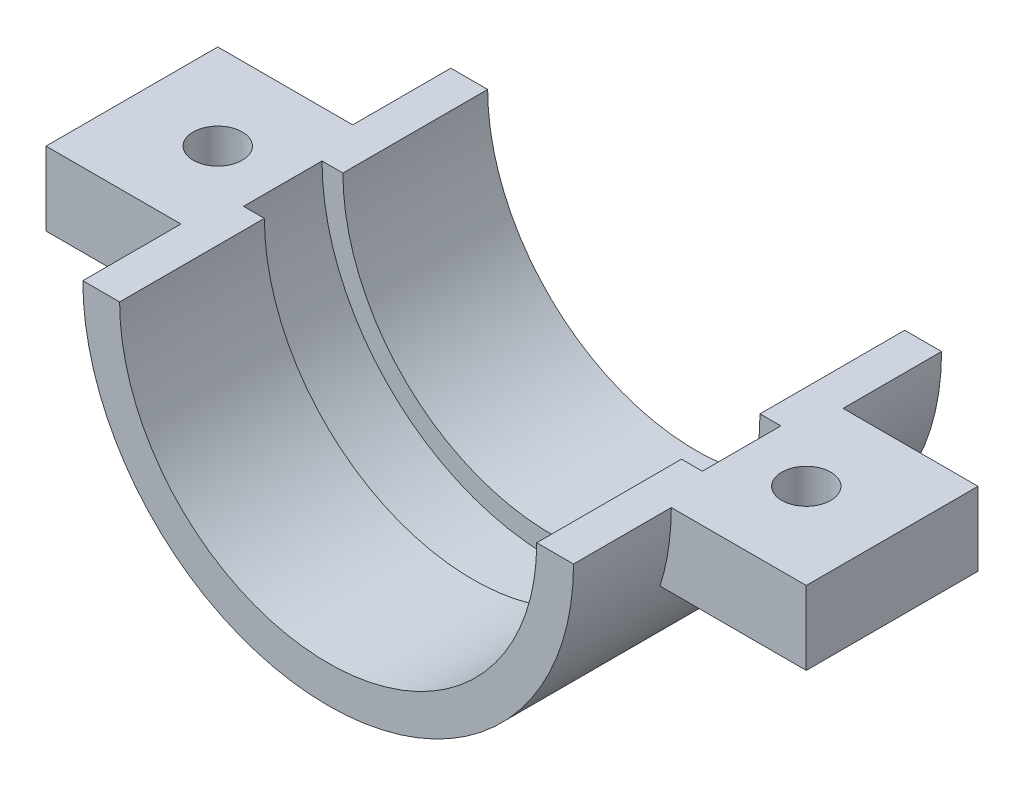
ISO-10303-21;
HEADER;
FILE_DESCRIPTION(('STEP AP214'),'2;1');
FILE_NAME('part.step','',(''),(''),'','','');
FILE_SCHEMA(('AUTOMOTIVE_DESIGN { 1 0 10303 214 1 1 1 1 }'));
ENDSEC;
DATA;
#1=APPLICATION_CONTEXT('core data for automotive mechanical design processes');
#2=APPLICATION_PROTOCOL_DEFINITION('international standard','automotive_design',2000,#1);
#3=PRODUCT_CONTEXT('',#1,'mechanical');
#4=PRODUCT('Part','Part','',(#3));
#5=PRODUCT_RELATED_PRODUCT_CATEGORY('part','',(#4));
#6=PRODUCT_DEFINITION_FORMATION('','',#4);
#7=PRODUCT_DEFINITION_CONTEXT('part definition',#1,'design');
#8=PRODUCT_DEFINITION('design','',#6,#7);
#9=PRODUCT_DEFINITION_SHAPE('','',#8);
#10=(LENGTH_UNIT() NAMED_UNIT(*) SI_UNIT(.MILLI.,.METRE.));
#11=(NAMED_UNIT(*) PLANE_ANGLE_UNIT() SI_UNIT($,.RADIAN.));
#12=(NAMED_UNIT(*) SI_UNIT($,.STERADIAN.) SOLID_ANGLE_UNIT());
#13=UNCERTAINTY_MEASURE_WITH_UNIT(LENGTH_MEASURE(1.E-05),#10,'distance_accuracy_value','');
#14=(GEOMETRIC_REPRESENTATION_CONTEXT(3) GLOBAL_UNCERTAINTY_ASSIGNED_CONTEXT((#13)) GLOBAL_UNIT_ASSIGNED_CONTEXT((#10,
#11,#12)) REPRESENTATION_CONTEXT('',''));
#15=CARTESIAN_POINT('',(0.,0.,0.));
#16=DIRECTION('',(0.,0.,1.));
#17=DIRECTION('',(1.,0.,0.));
#18=AXIS2_PLACEMENT_3D('',#15,#16,#17);
#19=CARTESIAN_POINT('',(0.,0.,15.));
#20=DIRECTION('',(0.,0.,-1.));
#21=DIRECTION('',(-1.,0.,0.));
#22=AXIS2_PLACEMENT_3D('',#19,#20,#21);
#23=CYLINDRICAL_SURFACE('',#22,8.5);
#24=CARTESIAN_POINT('',(0.,0.,9.1));
#25=DIRECTION('',(0.,0.,1.));
#26=DIRECTION('',(-1.,0.,0.));
#27=AXIS2_PLACEMENT_3D('',#24,#25,#26);
#28=CIRCLE('',#27,8.5);
#29=CARTESIAN_POINT('',(-8.5,0.,9.1));
#30=VERTEX_POINT('',#29);
#31=CARTESIAN_POINT('',(8.5,0.,9.1));
#32=VERTEX_POINT('',#31);
#33=EDGE_CURVE('E148',#30,#32,#28,.T.);
#34=ORIENTED_EDGE('',*,*,#33,.F.);
#35=DIRECTION('',(0.,0.,-1.));
#36=VECTOR('',#35,1.);
#37=CARTESIAN_POINT('',(-8.5,0.,15.));
#38=LINE('',#37,#36);
#39=CARTESIAN_POINT('',(-8.5,0.,15.));
#40=VERTEX_POINT('',#39);
#41=EDGE_CURVE('E188',#40,#30,#38,.T.);
#42=ORIENTED_EDGE('',*,*,#41,.F.);
#43=CARTESIAN_POINT('',(0.,0.,15.));
#44=DIRECTION('',(0.,0.,-1.));
#45=DIRECTION('',(1.,0.,0.));
#46=AXIS2_PLACEMENT_3D('',#43,#44,#45);
#47=CIRCLE('',#46,8.5);
#48=CARTESIAN_POINT('',(8.5,0.,15.));
#49=VERTEX_POINT('',#48);
#50=EDGE_CURVE('E172',#49,#40,#47,.T.);
#51=ORIENTED_EDGE('',*,*,#50,.F.);
#52=DIRECTION('',(0.,0.,-1.));
#53=VECTOR('',#52,1.);
#54=CARTESIAN_POINT('',(8.5,0.,15.));
#55=LINE('',#54,#53);
#56=EDGE_CURVE('E165',#49,#32,#55,.T.);
#57=ORIENTED_EDGE('',*,*,#56,.T.);
#58=EDGE_LOOP('',(#34,#42,#51,#57));
#59=FACE_BOUND('',#58,.T.);
#60=ADVANCED_FACE('F34',(#59),#23,.F.);
#61=CARTESIAN_POINT('',(-10.,0.,15.));
#62=DIRECTION('',(0.,-1.,0.));
#63=DIRECTION('',(0.,0.,-1.));
#64=AXIS2_PLACEMENT_3D('',#61,#62,#63);
#65=PLANE('',#64);
#66=CARTESIAN_POINT('',(-12.,0.,7.5));
#67=DIRECTION('',(0.,1.,0.));
#68=DIRECTION('',(0.,0.,1.));
#69=AXIS2_PLACEMENT_3D('',#66,#67,#68);
#70=CIRCLE('',#69,1.);
#71=CARTESIAN_POINT('',(-12.,0.,8.5));
#72=VERTEX_POINT('',#71);
#73=EDGE_CURVE('E301',#72,#72,#70,.T.);
#74=ORIENTED_EDGE('',*,*,#73,.F.);
#75=EDGE_LOOP('',(#74));
#76=FACE_BOUND('',#75,.T.);
#77=DIRECTION('',(1.,0.,0.));
#78=VECTOR('',#77,1.);
#79=CARTESIAN_POINT('',(-8.5,0.,9.1));
#80=LINE('',#79,#78);
#81=CARTESIAN_POINT('',(-9.35,0.,9.1));
#82=VERTEX_POINT('',#81);
#83=EDGE_CURVE('E155',#82,#30,#80,.T.);
#84=ORIENTED_EDGE('',*,*,#83,.F.);
#85=DIRECTION('',(0.,0.,-1.));
#86=VECTOR('',#85,1.);
#87=CARTESIAN_POINT('',(-9.35,0.,9.1));
#88=LINE('',#87,#86);
#89=CARTESIAN_POINT('',(-9.35,0.,5.9));
#90=VERTEX_POINT('',#89);
#91=EDGE_CURVE('E267',#82,#90,#88,.T.);
#92=ORIENTED_EDGE('',*,*,#91,.T.);
#93=DIRECTION('',(1.,0.,0.));
#94=VECTOR('',#93,1.);
#95=CARTESIAN_POINT('',(-8.5,0.,5.9));
#96=LINE('',#95,#94);
#97=CARTESIAN_POINT('',(-8.5,0.,5.9));
#98=VERTEX_POINT('',#97);
#99=EDGE_CURVE('E160',#90,#98,#96,.T.);
#100=ORIENTED_EDGE('',*,*,#99,.T.);
#101=CARTESIAN_POINT('',(-8.5,0.,0.));
#102=VERTEX_POINT('',#101);
#103=EDGE_CURVE('E187',#98,#102,#38,.T.);
#104=ORIENTED_EDGE('',*,*,#103,.T.);
#105=DIRECTION('',(-1.,0.,0.));
#106=VECTOR('',#105,1.);
#107=CARTESIAN_POINT('',(-10.,0.,0.));
#108=LINE('',#107,#106);
#109=CARTESIAN_POINT('',(-10.,0.,0.));
#110=VERTEX_POINT('',#109);
#111=EDGE_CURVE('E242',#102,#110,#108,.T.);
#112=ORIENTED_EDGE('',*,*,#111,.T.);
#113=DIRECTION('',(0.,0.,-1.));
#114=VECTOR('',#113,1.);
#115=CARTESIAN_POINT('',(-10.,0.,15.));
#116=LINE('',#115,#114);
#117=CARTESIAN_POINT('',(-10.,0.,4.00000000000003));
#118=VERTEX_POINT('',#117);
#119=EDGE_CURVE('E184',#118,#110,#116,.T.);
#120=ORIENTED_EDGE('',*,*,#119,.F.);
#121=DIRECTION('',(-1.,0.,0.));
#122=VECTOR('',#121,1.);
#123=CARTESIAN_POINT('',(-8.4999999999999,0.,4.00000000000005));
#124=LINE('',#123,#122);
#125=CARTESIAN_POINT('',(-15.4999999999999,0.,3.99999999999995));
#126=VERTEX_POINT('',#125);
#127=EDGE_CURVE('E224',#118,#126,#124,.T.);
#128=ORIENTED_EDGE('',*,*,#127,.T.);
#129=DIRECTION('',(0.,0.,1.));
#130=VECTOR('',#129,1.);
#131=CARTESIAN_POINT('',(-15.4999999999999,0.,3.99999999999995));
#132=LINE('',#131,#130);
#133=CARTESIAN_POINT('',(-15.5,0.,11.));
#134=VERTEX_POINT('',#133);
#135=EDGE_CURVE('E226',#126,#134,#132,.T.);
#136=ORIENTED_EDGE('',*,*,#135,.T.);
#137=DIRECTION('',(1.,0.,0.));
#138=VECTOR('',#137,1.);
#139=CARTESIAN_POINT('',(-15.5,0.,11.));
#140=LINE('',#139,#138);
#141=CARTESIAN_POINT('',(-10.,0.,11.0000000000001));
#142=VERTEX_POINT('',#141);
#143=EDGE_CURVE('E230',#134,#142,#140,.T.);
#144=ORIENTED_EDGE('',*,*,#143,.T.);
#145=CARTESIAN_POINT('',(-10.,0.,15.));
#146=VERTEX_POINT('',#145);
#147=EDGE_CURVE('E185',#146,#142,#116,.T.);
#148=ORIENTED_EDGE('',*,*,#147,.F.);
#149=DIRECTION('',(-1.,0.,0.));
#150=VECTOR('',#149,1.);
#151=CARTESIAN_POINT('',(-10.,0.,15.));
#152=LINE('',#151,#150);
#153=EDGE_CURVE('E235',#40,#146,#152,.T.);
#154=ORIENTED_EDGE('',*,*,#153,.F.);
#155=ORIENTED_EDGE('',*,*,#41,.T.);
#156=EDGE_LOOP('',(#84,#92,#100,#104,#112,#120,#128,#136,#144,#148,#154,#155));
#157=FACE_BOUND('',#156,.T.);
#158=ADVANCED_FACE('F313',(#76,#157),#65,.F.);
#159=CARTESIAN_POINT('',(8.5,0.,15.));
#160=DIRECTION('',(0.,-1.,0.));
#161=DIRECTION('',(0.,0.,-1.));
#162=AXIS2_PLACEMENT_3D('',#159,#160,#161);
#163=PLANE('',#162);
#164=CARTESIAN_POINT('',(12.,0.,7.51485119607753));
#165=DIRECTION('',(0.,1.,0.));
#166=DIRECTION('',(0.,0.,1.));
#167=AXIS2_PLACEMENT_3D('',#164,#165,#166);
#168=CIRCLE('',#167,1.);
#169=CARTESIAN_POINT('',(12.,0.,8.51485119607753));
#170=VERTEX_POINT('',#169);
#171=EDGE_CURVE('E270',#170,#170,#168,.T.);
#172=ORIENTED_EDGE('',*,*,#171,.F.);
#173=EDGE_LOOP('',(#172));
#174=FACE_BOUND('',#173,.T.);
#175=DIRECTION('',(1.,0.,0.));
#176=VECTOR('',#175,1.);
#177=CARTESIAN_POINT('',(9.35,0.,9.1));
#178=LINE('',#177,#176);
#179=CARTESIAN_POINT('',(9.35,0.,9.1));
#180=VERTEX_POINT('',#179);
#181=EDGE_CURVE('E152',#32,#180,#178,.T.);
#182=ORIENTED_EDGE('',*,*,#181,.F.);
#183=ORIENTED_EDGE('',*,*,#56,.F.);
#184=DIRECTION('',(-1.,0.,0.));
#185=VECTOR('',#184,1.);
#186=CARTESIAN_POINT('',(8.5,0.,15.));
#187=LINE('',#186,#185);
#188=CARTESIAN_POINT('',(10.,0.,15.));
#189=VERTEX_POINT('',#188);
#190=EDGE_CURVE('E178',#189,#49,#187,.T.);
#191=ORIENTED_EDGE('',*,*,#190,.F.);
#192=DIRECTION('',(0.,0.,-1.));
#193=VECTOR('',#192,1.);
#194=CARTESIAN_POINT('',(10.,0.,15.));
#195=LINE('',#194,#193);
#196=CARTESIAN_POINT('',(10.,0.,11.0148511960775));
#197=VERTEX_POINT('',#196);
#198=EDGE_CURVE('E176',#189,#197,#195,.T.);
#199=ORIENTED_EDGE('',*,*,#198,.T.);
#200=DIRECTION('',(1.,0.,0.));
#201=VECTOR('',#200,1.);
#202=CARTESIAN_POINT('',(15.5,0.,11.0148511960775));
#203=LINE('',#202,#201);
#204=CARTESIAN_POINT('',(15.5,0.,11.0148511960775));
#205=VERTEX_POINT('',#204);
#206=EDGE_CURVE('E275',#197,#205,#203,.T.);
#207=ORIENTED_EDGE('',*,*,#206,.T.);
#208=DIRECTION('',(0.,0.,-1.));
#209=VECTOR('',#208,1.);
#210=CARTESIAN_POINT('',(15.5,0.,4.01485119607753));
#211=LINE('',#210,#209);
#212=CARTESIAN_POINT('',(15.5,0.,4.01485119607753));
#213=VERTEX_POINT('',#212);
#214=EDGE_CURVE('E288',#205,#213,#211,.T.);
#215=ORIENTED_EDGE('',*,*,#214,.T.);
#216=DIRECTION('',(-1.,0.,0.));
#217=VECTOR('',#216,1.);
#218=CARTESIAN_POINT('',(8.5,0.,4.01485119607753));
#219=LINE('',#218,#217);
#220=CARTESIAN_POINT('',(10.,0.,4.01485119607753));
#221=VERTEX_POINT('',#220);
#222=EDGE_CURVE('E57',#213,#221,#219,.T.);
#223=ORIENTED_EDGE('',*,*,#222,.T.);
#224=CARTESIAN_POINT('',(10.,0.,0.));
#225=VERTEX_POINT('',#224);
#226=EDGE_CURVE('E173',#221,#225,#195,.T.);
#227=ORIENTED_EDGE('',*,*,#226,.T.);
#228=DIRECTION('',(-1.,0.,0.));
#229=VECTOR('',#228,1.);
#230=CARTESIAN_POINT('',(8.5,0.,0.));
#231=LINE('',#230,#229);
#232=CARTESIAN_POINT('',(8.5,0.,0.));
#233=VERTEX_POINT('',#232);
#234=EDGE_CURVE('E180',#225,#233,#231,.T.);
#235=ORIENTED_EDGE('',*,*,#234,.T.);
#236=CARTESIAN_POINT('',(8.5,0.,5.9));
#237=VERTEX_POINT('',#236);
#238=EDGE_CURVE('E174',#237,#233,#55,.T.);
#239=ORIENTED_EDGE('',*,*,#238,.F.);
#240=DIRECTION('',(1.,0.,0.));
#241=VECTOR('',#240,1.);
#242=CARTESIAN_POINT('',(9.35,0.,5.9));
#243=LINE('',#242,#241);
#244=CARTESIAN_POINT('',(9.35,0.,5.9));
#245=VERTEX_POINT('',#244);
#246=EDGE_CURVE('E259',#237,#245,#243,.T.);
#247=ORIENTED_EDGE('',*,*,#246,.T.);
#248=DIRECTION('',(0.,0.,-1.));
#249=VECTOR('',#248,1.);
#250=CARTESIAN_POINT('',(9.35,0.,9.1));
#251=LINE('',#250,#249);
#252=EDGE_CURVE('E168',#180,#245,#251,.T.);
#253=ORIENTED_EDGE('',*,*,#252,.F.);
#254=EDGE_LOOP('',(#182,#183,#191,#199,#207,#215,#223,#227,#235,#239,#247,#253));
#255=FACE_BOUND('',#254,.T.);
#256=ADVANCED_FACE('F163',(#174,#255),#163,.F.);
#257=ORIENTED_EDGE('',*,*,#103,.F.);
#258=CARTESIAN_POINT('',(0.,0.,5.9));
#259=DIRECTION('',(0.,0.,1.));
#260=DIRECTION('',(-1.,0.,0.));
#261=AXIS2_PLACEMENT_3D('',#258,#259,#260);
#262=CIRCLE('',#261,8.5);
#263=EDGE_CURVE('E257',#98,#237,#262,.T.);
#264=ORIENTED_EDGE('',*,*,#263,.T.);
#265=ORIENTED_EDGE('',*,*,#238,.T.);
#266=CARTESIAN_POINT('',(0.,0.,0.));
#267=DIRECTION('',(0.,0.,-1.));
#268=DIRECTION('',(1.,0.,0.));
#269=AXIS2_PLACEMENT_3D('',#266,#267,#268);
#270=CIRCLE('',#269,8.5);
#271=EDGE_CURVE('E232',#233,#102,#270,.T.);
#272=ORIENTED_EDGE('',*,*,#271,.T.);
#273=EDGE_LOOP('',(#257,#264,#265,#272));
#274=FACE_BOUND('',#273,.T.);
#275=ADVANCED_FACE('F36',(#274),#23,.F.);
#276=CARTESIAN_POINT('',(0.,0.,15.));
#277=DIRECTION('',(0.,0.,-1.));
#278=DIRECTION('',(-1.,0.,0.));
#279=AXIS2_PLACEMENT_3D('',#276,#277,#278);
#280=CYLINDRICAL_SURFACE('',#279,10.);
#281=ORIENTED_EDGE('',*,*,#226,.F.);
#282=CARTESIAN_POINT('',(0.,0.,4.01485119607753));
#283=DIRECTION('',(0.,0.,-1.));
#284=DIRECTION('',(-1.,0.,0.));
#285=AXIS2_PLACEMENT_3D('',#282,#283,#284);
#286=CIRCLE('',#285,10.);
#287=CARTESIAN_POINT('',(9.53939201416946,-3.,4.01485119607753));
#288=VERTEX_POINT('',#287);
#289=EDGE_CURVE('E298',#221,#288,#286,.T.);
#290=ORIENTED_EDGE('',*,*,#289,.T.);
#291=DIRECTION('',(0.,0.,-1.));
#292=VECTOR('',#291,1.);
#293=CARTESIAN_POINT('',(9.53939201416946,-3.,15.));
#294=LINE('',#293,#292);
#295=CARTESIAN_POINT('',(9.53939201416946,-3.,11.0148511960775));
#296=VERTEX_POINT('',#295);
#297=EDGE_CURVE('E11',#288,#296,#294,.F.);
#298=ORIENTED_EDGE('',*,*,#297,.T.);
#299=CARTESIAN_POINT('',(0.,0.,11.0148511960775));
#300=DIRECTION('',(0.,0.,1.));
#301=DIRECTION('',(1.,0.,0.));
#302=AXIS2_PLACEMENT_3D('',#299,#300,#301);
#303=CIRCLE('',#302,10.);
#304=EDGE_CURVE('E293',#296,#197,#303,.T.);
#305=ORIENTED_EDGE('',*,*,#304,.T.);
#306=ORIENTED_EDGE('',*,*,#198,.F.);
#307=CARTESIAN_POINT('',(0.,0.,15.));
#308=DIRECTION('',(0.,0.,1.));
#309=DIRECTION('',(1.,0.,0.));
#310=AXIS2_PLACEMENT_3D('',#307,#308,#309);
#311=CIRCLE('',#310,10.);
#312=EDGE_CURVE('E237',#146,#189,#311,.T.);
#313=ORIENTED_EDGE('',*,*,#312,.F.);
#314=ORIENTED_EDGE('',*,*,#147,.T.);
#315=CARTESIAN_POINT('',(0.,0.,11.0000000000002));
#316=DIRECTION('',(0.,0.,1.));
#317=DIRECTION('',(1.,0.,0.));
#318=AXIS2_PLACEMENT_3D('',#315,#316,#317);
#319=CIRCLE('',#318,10.);
#320=CARTESIAN_POINT('',(-9.53939201416946,-3.,11.0000000000001));
#321=VERTEX_POINT('',#320);
#322=EDGE_CURVE('E42',#142,#321,#319,.T.);
#323=ORIENTED_EDGE('',*,*,#322,.T.);
#324=DIRECTION('',(0.,0.,-1.));
#325=VECTOR('',#324,1.);
#326=CARTESIAN_POINT('',(-9.53939201416946,-3.,15.));
#327=LINE('',#326,#325);
#328=CARTESIAN_POINT('',(-9.53939201416946,-3.,3.99999999999995));
#329=VERTEX_POINT('',#328);
#330=EDGE_CURVE('E190',#329,#321,#327,.F.);
#331=ORIENTED_EDGE('',*,*,#330,.F.);
#332=CARTESIAN_POINT('',(0.,0.,4.00000000000017));
#333=DIRECTION('',(0.,0.,-1.));
#334=DIRECTION('',(-1.,0.,0.));
#335=AXIS2_PLACEMENT_3D('',#332,#333,#334);
#336=CIRCLE('',#335,10.);
#337=EDGE_CURVE('E193',#329,#118,#336,.T.);
#338=ORIENTED_EDGE('',*,*,#337,.T.);
#339=ORIENTED_EDGE('',*,*,#119,.T.);
#340=CARTESIAN_POINT('',(0.,0.,0.));
#341=DIRECTION('',(0.,0.,1.));
#342=DIRECTION('',(1.,0.,0.));
#343=AXIS2_PLACEMENT_3D('',#340,#341,#342);
#344=CIRCLE('',#343,10.);
#345=EDGE_CURVE('E244',#110,#225,#344,.T.);
#346=ORIENTED_EDGE('',*,*,#345,.T.);
#347=EDGE_LOOP('',(#281,#290,#298,#305,#306,#313,#314,#323,#331,#338,#339,#346));
#348=FACE_BOUND('',#347,.T.);
#349=ADVANCED_FACE('F198',(#348),#280,.T.);
#350=CARTESIAN_POINT('',(0.,0.,15.));
#351=DIRECTION('',(0.,0.,1.));
#352=DIRECTION('',(1.,0.,0.));
#353=AXIS2_PLACEMENT_3D('',#350,#351,#352);
#354=PLANE('',#353);
#355=ORIENTED_EDGE('',*,*,#50,.T.);
#356=ORIENTED_EDGE('',*,*,#153,.T.);
#357=ORIENTED_EDGE('',*,*,#312,.T.);
#358=ORIENTED_EDGE('',*,*,#190,.T.);
#359=EDGE_LOOP('',(#355,#356,#357,#358));
#360=FACE_BOUND('',#359,.T.);
#361=ADVANCED_FACE('F333',(#360),#354,.T.);
#362=CARTESIAN_POINT('',(0.,0.,0.));
#363=DIRECTION('',(0.,0.,1.));
#364=DIRECTION('',(1.,0.,0.));
#365=AXIS2_PLACEMENT_3D('',#362,#363,#364);
#366=PLANE('',#365);
#367=ORIENTED_EDGE('',*,*,#271,.F.);
#368=ORIENTED_EDGE('',*,*,#234,.F.);
#369=ORIENTED_EDGE('',*,*,#345,.F.);
#370=ORIENTED_EDGE('',*,*,#111,.F.);
#371=EDGE_LOOP('',(#367,#368,#369,#370));
#372=FACE_BOUND('',#371,.T.);
#373=ADVANCED_FACE('F253',(#372),#366,.F.);
#374=CARTESIAN_POINT('',(0.,-3.,0.));
#375=DIRECTION('',(0.,1.,0.));
#376=DIRECTION('',(0.,0.,1.));
#377=AXIS2_PLACEMENT_3D('',#374,#375,#376);
#378=PLANE('',#377);
#379=CARTESIAN_POINT('',(-12.,-3.,7.5));
#380=DIRECTION('',(0.,1.,0.));
#381=DIRECTION('',(0.,0.,1.));
#382=AXIS2_PLACEMENT_3D('',#379,#380,#381);
#383=CIRCLE('',#382,1.);
#384=CARTESIAN_POINT('',(-12.,-3.,8.5));
#385=VERTEX_POINT('',#384);
#386=EDGE_CURVE('E227',#385,#385,#383,.T.);
#387=ORIENTED_EDGE('',*,*,#386,.T.);
#388=EDGE_LOOP('',(#387));
#389=FACE_BOUND('',#388,.T.);
#390=DIRECTION('',(-1.,0.,0.));
#391=VECTOR('',#390,1.);
#392=CARTESIAN_POINT('',(-8.4999999999999,-3.,4.00000000000005));
#393=LINE('',#392,#391);
#394=CARTESIAN_POINT('',(-15.4999999999999,-3.,3.99999999999995));
#395=VERTEX_POINT('',#394);
#396=EDGE_CURVE('E212',#329,#395,#393,.T.);
#397=ORIENTED_EDGE('',*,*,#396,.F.);
#398=ORIENTED_EDGE('',*,*,#330,.T.);
#399=DIRECTION('',(1.,0.,0.));
#400=VECTOR('',#399,1.);
#401=CARTESIAN_POINT('',(-15.5,-3.,11.));
#402=LINE('',#401,#400);
#403=CARTESIAN_POINT('',(-15.5,-3.,11.));
#404=VERTEX_POINT('',#403);
#405=EDGE_CURVE('E211',#404,#321,#402,.T.);
#406=ORIENTED_EDGE('',*,*,#405,.F.);
#407=DIRECTION('',(0.,0.,1.));
#408=VECTOR('',#407,1.);
#409=CARTESIAN_POINT('',(-15.4999999999999,-3.,3.99999999999995));
#410=LINE('',#409,#408);
#411=EDGE_CURVE('E217',#395,#404,#410,.T.);
#412=ORIENTED_EDGE('',*,*,#411,.F.);
#413=EDGE_LOOP('',(#397,#398,#406,#412));
#414=FACE_BOUND('',#413,.T.);
#415=ADVANCED_FACE('F209',(#389,#414),#378,.F.);
#416=CARTESIAN_POINT('',(-15.5,-3.,11.));
#417=DIRECTION('',(0.,0.,1.));
#418=DIRECTION('',(1.,0.,0.));
#419=AXIS2_PLACEMENT_3D('',#416,#417,#418);
#420=PLANE('',#419);
#421=ORIENTED_EDGE('',*,*,#322,.F.);
#422=ORIENTED_EDGE('',*,*,#143,.F.);
#423=DIRECTION('',(0.,1.,0.));
#424=VECTOR('',#423,1.);
#425=CARTESIAN_POINT('',(-15.5,-3.,11.));
#426=LINE('',#425,#424);
#427=EDGE_CURVE('E214',#404,#134,#426,.T.);
#428=ORIENTED_EDGE('',*,*,#427,.F.);
#429=ORIENTED_EDGE('',*,*,#405,.T.);
#430=EDGE_LOOP('',(#421,#422,#428,#429));
#431=FACE_BOUND('',#430,.T.);
#432=ADVANCED_FACE('F213',(#431),#420,.T.);
#433=CARTESIAN_POINT('',(-15.4999999999999,-3.,3.99999999999995));
#434=DIRECTION('',(-1.,0.,0.));
#435=DIRECTION('',(0.,0.,1.));
#436=AXIS2_PLACEMENT_3D('',#433,#434,#435);
#437=PLANE('',#436);
#438=ORIENTED_EDGE('',*,*,#135,.F.);
#439=DIRECTION('',(0.,1.,0.));
#440=VECTOR('',#439,1.);
#441=CARTESIAN_POINT('',(-15.4999999999999,-3.,3.99999999999995));
#442=LINE('',#441,#440);
#443=EDGE_CURVE('E216',#395,#126,#442,.T.);
#444=ORIENTED_EDGE('',*,*,#443,.F.);
#445=ORIENTED_EDGE('',*,*,#411,.T.);
#446=ORIENTED_EDGE('',*,*,#427,.T.);
#447=EDGE_LOOP('',(#438,#444,#445,#446));
#448=FACE_BOUND('',#447,.T.);
#449=ADVANCED_FACE('F311',(#448),#437,.T.);
#450=CARTESIAN_POINT('',(-8.4999999999999,-3.,4.00000000000005));
#451=DIRECTION('',(0.,0.,-1.));
#452=DIRECTION('',(-1.,0.,0.));
#453=AXIS2_PLACEMENT_3D('',#450,#451,#452);
#454=PLANE('',#453);
#455=ORIENTED_EDGE('',*,*,#337,.F.);
#456=ORIENTED_EDGE('',*,*,#396,.T.);
#457=ORIENTED_EDGE('',*,*,#443,.T.);
#458=ORIENTED_EDGE('',*,*,#127,.F.);
#459=EDGE_LOOP('',(#455,#456,#457,#458));
#460=FACE_BOUND('',#459,.T.);
#461=ADVANCED_FACE('F307',(#460),#454,.T.);
#462=CARTESIAN_POINT('',(-12.,-3.,7.5));
#463=DIRECTION('',(0.,1.,0.));
#464=DIRECTION('',(0.,0.,1.));
#465=AXIS2_PLACEMENT_3D('',#462,#463,#464);
#466=CYLINDRICAL_SURFACE('',#465,1.);
#467=ORIENTED_EDGE('',*,*,#386,.F.);
#468=EDGE_LOOP('',(#467));
#469=FACE_BOUND('',#468,.T.);
#470=ORIENTED_EDGE('',*,*,#73,.T.);
#471=EDGE_LOOP('',(#470));
#472=FACE_BOUND('',#471,.T.);
#473=ADVANCED_FACE('F348',(#469,#472),#466,.F.);
#474=CARTESIAN_POINT('',(0.,-3.,0.));
#475=DIRECTION('',(0.,-1.,0.));
#476=DIRECTION('',(0.,0.,-1.));
#477=AXIS2_PLACEMENT_3D('',#474,#475,#476);
#478=PLANE('',#477);
#479=CARTESIAN_POINT('',(12.,-3.,7.51485119607753));
#480=DIRECTION('',(0.,1.,0.));
#481=DIRECTION('',(0.,0.,1.));
#482=AXIS2_PLACEMENT_3D('',#479,#480,#481);
#483=CIRCLE('',#482,1.);
#484=CARTESIAN_POINT('',(12.,-3.,8.51485119607753));
#485=VERTEX_POINT('',#484);
#486=EDGE_CURVE('E272',#485,#485,#483,.T.);
#487=ORIENTED_EDGE('',*,*,#486,.T.);
#488=EDGE_LOOP('',(#487));
#489=FACE_BOUND('',#488,.T.);
#490=ORIENTED_EDGE('',*,*,#297,.F.);
#491=DIRECTION('',(-1.,0.,0.));
#492=VECTOR('',#491,1.);
#493=CARTESIAN_POINT('',(8.5,-3.,4.01485119607753));
#494=LINE('',#493,#492);
#495=CARTESIAN_POINT('',(15.5,-3.,4.01485119607753));
#496=VERTEX_POINT('',#495);
#497=EDGE_CURVE('E283',#496,#288,#494,.T.);
#498=ORIENTED_EDGE('',*,*,#497,.F.);
#499=DIRECTION('',(0.,0.,-1.));
#500=VECTOR('',#499,1.);
#501=CARTESIAN_POINT('',(15.5,-3.,4.01485119607753));
#502=LINE('',#501,#500);
#503=CARTESIAN_POINT('',(15.5,-3.,11.0148511960775));
#504=VERTEX_POINT('',#503);
#505=EDGE_CURVE('E280',#504,#496,#502,.T.);
#506=ORIENTED_EDGE('',*,*,#505,.F.);
#507=DIRECTION('',(1.,0.,0.));
#508=VECTOR('',#507,1.);
#509=CARTESIAN_POINT('',(15.5,-3.,11.0148511960775));
#510=LINE('',#509,#508);
#511=EDGE_CURVE('E278',#296,#504,#510,.T.);
#512=ORIENTED_EDGE('',*,*,#511,.F.);
#513=EDGE_LOOP('',(#490,#498,#506,#512));
#514=FACE_BOUND('',#513,.T.);
#515=ADVANCED_FACE('F358',(#489,#514),#478,.T.);
#516=CARTESIAN_POINT('',(8.5,-3.,4.01485119607753));
#517=DIRECTION('',(0.,0.,-1.));
#518=DIRECTION('',(-1.,0.,0.));
#519=AXIS2_PLACEMENT_3D('',#516,#517,#518);
#520=PLANE('',#519);
#521=ORIENTED_EDGE('',*,*,#289,.F.);
#522=ORIENTED_EDGE('',*,*,#222,.F.);
#523=DIRECTION('',(0.,1.,0.));
#524=VECTOR('',#523,1.);
#525=CARTESIAN_POINT('',(15.5,-3.,4.01485119607753));
#526=LINE('',#525,#524);
#527=EDGE_CURVE('E291',#496,#213,#526,.T.);
#528=ORIENTED_EDGE('',*,*,#527,.F.);
#529=ORIENTED_EDGE('',*,*,#497,.T.);
#530=EDGE_LOOP('',(#521,#522,#528,#529));
#531=FACE_BOUND('',#530,.T.);
#532=ADVANCED_FACE('F364',(#531),#520,.T.);
#533=CARTESIAN_POINT('',(15.5,-3.,11.0148511960775));
#534=DIRECTION('',(0.,0.,1.));
#535=DIRECTION('',(1.,0.,0.));
#536=AXIS2_PLACEMENT_3D('',#533,#534,#535);
#537=PLANE('',#536);
#538=ORIENTED_EDGE('',*,*,#304,.F.);
#539=ORIENTED_EDGE('',*,*,#511,.T.);
#540=DIRECTION('',(0.,1.,0.));
#541=VECTOR('',#540,1.);
#542=CARTESIAN_POINT('',(15.5,-3.,11.0148511960775));
#543=LINE('',#542,#541);
#544=EDGE_CURVE('E286',#504,#205,#543,.T.);
#545=ORIENTED_EDGE('',*,*,#544,.T.);
#546=ORIENTED_EDGE('',*,*,#206,.F.);
#547=EDGE_LOOP('',(#538,#539,#545,#546));
#548=FACE_BOUND('',#547,.T.);
#549=ADVANCED_FACE('F360',(#548),#537,.T.);
#550=CARTESIAN_POINT('',(15.5,-3.,4.01485119607753));
#551=DIRECTION('',(1.,0.,0.));
#552=DIRECTION('',(0.,0.,-1.));
#553=AXIS2_PLACEMENT_3D('',#550,#551,#552);
#554=PLANE('',#553);
#555=ORIENTED_EDGE('',*,*,#214,.F.);
#556=ORIENTED_EDGE('',*,*,#544,.F.);
#557=ORIENTED_EDGE('',*,*,#505,.T.);
#558=ORIENTED_EDGE('',*,*,#527,.T.);
#559=EDGE_LOOP('',(#555,#556,#557,#558));
#560=FACE_BOUND('',#559,.T.);
#561=ADVANCED_FACE('F363',(#560),#554,.T.);
#562=CARTESIAN_POINT('',(12.,-3.,7.51485119607753));
#563=DIRECTION('',(0.,1.,0.));
#564=DIRECTION('',(0.,0.,1.));
#565=AXIS2_PLACEMENT_3D('',#562,#563,#564);
#566=CYLINDRICAL_SURFACE('',#565,1.);
#567=ORIENTED_EDGE('',*,*,#486,.F.);
#568=EDGE_LOOP('',(#567));
#569=FACE_BOUND('',#568,.T.);
#570=ORIENTED_EDGE('',*,*,#171,.T.);
#571=EDGE_LOOP('',(#570));
#572=FACE_BOUND('',#571,.T.);
#573=ADVANCED_FACE('F368',(#569,#572),#566,.F.);
#574=CARTESIAN_POINT('',(0.,0.,9.1));
#575=DIRECTION('',(0.,0.,-1.));
#576=DIRECTION('',(-1.,0.,0.));
#577=AXIS2_PLACEMENT_3D('',#574,#575,#576);
#578=CYLINDRICAL_SURFACE('',#577,9.35);
#579=CARTESIAN_POINT('',(0.,0.,5.9));
#580=DIRECTION('',(0.,0.,-1.));
#581=DIRECTION('',(-1.,0.,0.));
#582=AXIS2_PLACEMENT_3D('',#579,#580,#581);
#583=CIRCLE('',#582,9.35);
#584=EDGE_CURVE('E49',#245,#90,#583,.T.);
#585=ORIENTED_EDGE('',*,*,#584,.T.);
#586=ORIENTED_EDGE('',*,*,#91,.F.);
#587=CARTESIAN_POINT('',(0.,0.,9.1));
#588=DIRECTION('',(0.,0.,-1.));
#589=DIRECTION('',(-1.,0.,0.));
#590=AXIS2_PLACEMENT_3D('',#587,#588,#589);
#591=CIRCLE('',#590,9.35);
#592=EDGE_CURVE('E169',#180,#82,#591,.T.);
#593=ORIENTED_EDGE('',*,*,#592,.F.);
#594=ORIENTED_EDGE('',*,*,#252,.T.);
#595=EDGE_LOOP('',(#585,#586,#593,#594));
#596=FACE_BOUND('',#595,.T.);
#597=ADVANCED_FACE('F320',(#596),#578,.F.);
#598=CARTESIAN_POINT('',(0.,0.,9.1));
#599=DIRECTION('',(0.,0.,-1.));
#600=DIRECTION('',(-1.,0.,0.));
#601=AXIS2_PLACEMENT_3D('',#598,#599,#600);
#602=PLANE('',#601);
#603=ORIENTED_EDGE('',*,*,#33,.T.);
#604=ORIENTED_EDGE('',*,*,#181,.T.);
#605=ORIENTED_EDGE('',*,*,#592,.T.);
#606=ORIENTED_EDGE('',*,*,#83,.T.);
#607=EDGE_LOOP('',(#603,#604,#605,#606));
#608=FACE_BOUND('',#607,.T.);
#609=ADVANCED_FACE('F150',(#608),#602,.T.);
#610=CARTESIAN_POINT('',(0.,0.,5.9));
#611=DIRECTION('',(0.,0.,-1.));
#612=DIRECTION('',(-1.,0.,0.));
#613=AXIS2_PLACEMENT_3D('',#610,#611,#612);
#614=PLANE('',#613);
#615=ORIENTED_EDGE('',*,*,#263,.F.);
#616=ORIENTED_EDGE('',*,*,#99,.F.);
#617=ORIENTED_EDGE('',*,*,#584,.F.);
#618=ORIENTED_EDGE('',*,*,#246,.F.);
#619=EDGE_LOOP('',(#615,#616,#617,#618));
#620=FACE_BOUND('',#619,.T.);
#621=ADVANCED_FACE('F314',(#620),#614,.F.);
#622=CLOSED_SHELL('',(#60,#158,#256,#275,#349,#361,#373,#415,#432,#449,#461,#473,#515,#532,#549,
#561,#573,#597,#609,#621));
#623=MANIFOLD_SOLID_BREP('B2',#622);
#624=ADVANCED_BREP_SHAPE_REPRESENTATION('',(#18,#623),#14);
#625=SHAPE_DEFINITION_REPRESENTATION(#9,#624);
ENDSEC;
END-ISO-10303-21;
